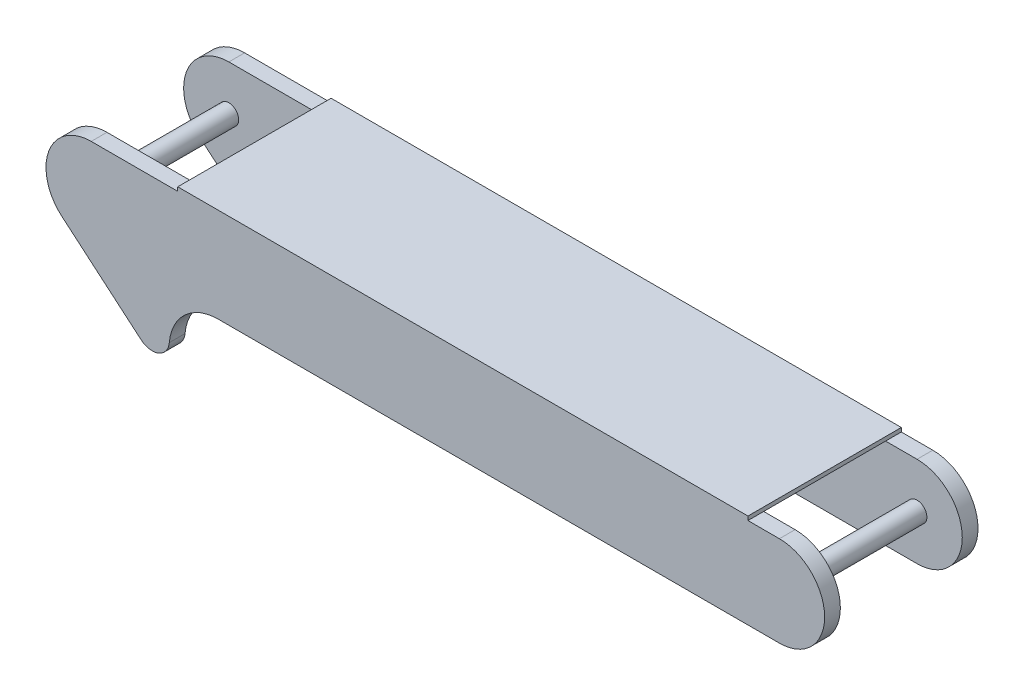
ISO-10303-21;
HEADER;
FILE_DESCRIPTION(('STEP AP214'),'2;1');
FILE_NAME('part.step','',(''),(''),'','','');
FILE_SCHEMA(('AUTOMOTIVE_DESIGN { 1 0 10303 214 1 1 1 1 }'));
ENDSEC;
DATA;
#1=APPLICATION_CONTEXT('core data for automotive mechanical design processes');
#2=APPLICATION_PROTOCOL_DEFINITION('international standard','automotive_design',2000,#1);
#3=PRODUCT_CONTEXT('',#1,'mechanical');
#4=PRODUCT('Part','Part','',(#3));
#5=PRODUCT_RELATED_PRODUCT_CATEGORY('part','',(#4));
#6=PRODUCT_DEFINITION_FORMATION('','',#4);
#7=PRODUCT_DEFINITION_CONTEXT('part definition',#1,'design');
#8=PRODUCT_DEFINITION('design','',#6,#7);
#9=PRODUCT_DEFINITION_SHAPE('','',#8);
#10=(LENGTH_UNIT() NAMED_UNIT(*) SI_UNIT(.MILLI.,.METRE.));
#11=(NAMED_UNIT(*) PLANE_ANGLE_UNIT() SI_UNIT($,.RADIAN.));
#12=(NAMED_UNIT(*) SI_UNIT($,.STERADIAN.) SOLID_ANGLE_UNIT());
#13=UNCERTAINTY_MEASURE_WITH_UNIT(LENGTH_MEASURE(1.E-05),#10,'distance_accuracy_value','');
#14=(GEOMETRIC_REPRESENTATION_CONTEXT(3) GLOBAL_UNCERTAINTY_ASSIGNED_CONTEXT((#13)) GLOBAL_UNIT_ASSIGNED_CONTEXT((#10,
#11,#12)) REPRESENTATION_CONTEXT('',''));
#15=CARTESIAN_POINT('',(0.,0.,0.));
#16=DIRECTION('',(0.,0.,1.));
#17=DIRECTION('',(1.,0.,0.));
#18=AXIS2_PLACEMENT_3D('',#15,#16,#17);
#19=CARTESIAN_POINT('',(0.,0.,31.));
#20=DIRECTION('',(0.,0.,1.));
#21=DIRECTION('',(1.,0.,0.));
#22=AXIS2_PLACEMENT_3D('',#19,#20,#21);
#23=PLANE('',#22);
#24=CARTESIAN_POINT('',(0.,0.,31.0000000000059));
#25=DIRECTION('',(0.,0.,1.));
#26=DIRECTION('',(1.,0.,0.));
#27=AXIS2_PLACEMENT_3D('',#24,#25,#26);
#28=CIRCLE('',#27,5.);
#29=CARTESIAN_POINT('',(5.,0.,31.0000000000059));
#30=VERTEX_POINT('',#29);
#31=EDGE_CURVE('E45',#30,#30,#28,.F.);
#32=ORIENTED_EDGE('',*,*,#31,.F.);
#33=EDGE_LOOP('',(#32));
#34=FACE_BOUND('',#33,.T.);
#35=CARTESIAN_POINT('',(0.,0.,31.));
#36=DIRECTION('',(0.,0.,1.));
#37=DIRECTION('',(1.,0.,0.));
#38=AXIS2_PLACEMENT_3D('',#35,#36,#37);
#39=CIRCLE('',#38,23.);
#40=CARTESIAN_POINT('',(0.,23.,31.));
#41=VERTEX_POINT('',#40);
#42=CARTESIAN_POINT('',(-14.8826787628973,-17.5358453699959,31.));
#43=VERTEX_POINT('',#42);
#44=EDGE_CURVE('E238',#41,#43,#39,.T.);
#45=ORIENTED_EDGE('',*,*,#44,.F.);
#46=DIRECTION('',(-1.,0.,0.));
#47=VECTOR('',#46,1.);
#48=CARTESIAN_POINT('',(0.,23.,31.));
#49=LINE('',#48,#47);
#50=CARTESIAN_POINT('',(44.,23.,31.));
#51=VERTEX_POINT('',#50);
#52=EDGE_CURVE('E257',#51,#41,#49,.T.);
#53=ORIENTED_EDGE('',*,*,#52,.F.);
#54=DIRECTION('',(1.,0.,0.));
#55=VECTOR('',#54,1.);
#56=CARTESIAN_POINT('',(0.,23.,31.));
#57=LINE('',#56,#55);
#58=CARTESIAN_POINT('',(334.,23.,31.));
#59=VERTEX_POINT('',#58);
#60=EDGE_CURVE('E234',#51,#59,#57,.T.);
#61=ORIENTED_EDGE('',*,*,#60,.T.);
#62=CARTESIAN_POINT('',(350.,23.,31.));
#63=VERTEX_POINT('',#62);
#64=EDGE_CURVE('E258',#63,#59,#49,.T.);
#65=ORIENTED_EDGE('',*,*,#64,.F.);
#66=CARTESIAN_POINT('',(350.,0.,31.));
#67=DIRECTION('',(0.,0.,1.));
#68=DIRECTION('',(-1.,0.,0.));
#69=AXIS2_PLACEMENT_3D('',#66,#67,#68);
#70=CIRCLE('',#69,23.);
#71=CARTESIAN_POINT('',(350.,-23.,31.));
#72=VERTEX_POINT('',#71);
#73=EDGE_CURVE('E254',#72,#63,#70,.T.);
#74=ORIENTED_EDGE('',*,*,#73,.F.);
#75=DIRECTION('',(1.,0.,0.));
#76=VECTOR('',#75,1.);
#77=CARTESIAN_POINT('',(64.6164022465225,-23.,31.));
#78=LINE('',#77,#76);
#79=CARTESIAN_POINT('',(64.6164022465225,-23.,31.));
#80=VERTEX_POINT('',#79);
#81=EDGE_CURVE('E251',#80,#72,#78,.T.);
#82=ORIENTED_EDGE('',*,*,#81,.F.);
#83=CARTESIAN_POINT('',(64.6164022465225,-48.,31.));
#84=DIRECTION('',(0.,0.,-1.));
#85=DIRECTION('',(1.,0.,0.));
#86=AXIS2_PLACEMENT_3D('',#83,#84,#85);
#87=CIRCLE('',#86,25.);
#88=CARTESIAN_POINT('',(39.7153635453947,-45.7777777777778,31.));
#89=VERTEX_POINT('',#88);
#90=EDGE_CURVE('E248',#89,#80,#87,.T.);
#91=ORIENTED_EDGE('',*,*,#90,.F.);
#92=CARTESIAN_POINT('',(31.,-45.,31.));
#93=DIRECTION('',(0.,0.,1.));
#94=DIRECTION('',(1.,0.,0.));
#95=AXIS2_PLACEMENT_3D('',#92,#93,#94);
#96=CIRCLE('',#95,8.75000000000001);
#97=CARTESIAN_POINT('',(25.3381113402021,-51.6712455211941,31.));
#98=VERTEX_POINT('',#97);
#99=EDGE_CURVE('E245',#98,#89,#96,.T.);
#100=ORIENTED_EDGE('',*,*,#99,.F.);
#101=DIRECTION('',(0.762428059565039,-0.647072989691186,0.));
#102=VECTOR('',#101,1.);
#103=CARTESIAN_POINT('',(-14.8826787628973,-17.5358453699959,31.));
#104=LINE('',#103,#102);
#105=EDGE_CURVE('E241',#43,#98,#104,.T.);
#106=ORIENTED_EDGE('',*,*,#105,.F.);
#107=EDGE_LOOP('',(#45,#53,#61,#65,#74,#82,#91,#100,#106));
#108=FACE_BOUND('',#107,.T.);
#109=CARTESIAN_POINT('',(350.,0.,31.0000000000059));
#110=DIRECTION('',(0.,0.,1.));
#111=DIRECTION('',(1.,0.,0.));
#112=AXIS2_PLACEMENT_3D('',#109,#110,#111);
#113=CIRCLE('',#112,4.99999999999999);
#114=CARTESIAN_POINT('',(355.,0.,31.0000000000059));
#115=VERTEX_POINT('',#114);
#116=EDGE_CURVE('E11',#115,#115,#113,.F.);
#117=ORIENTED_EDGE('',*,*,#116,.F.);
#118=EDGE_LOOP('',(#117));
#119=FACE_BOUND('',#118,.T.);
#120=ADVANCED_FACE('F37',(#34,#108,#119),#23,.F.);
#121=CARTESIAN_POINT('',(0.,0.,-31.));
#122=DIRECTION('',(0.,0.,1.));
#123=DIRECTION('',(1.,0.,0.));
#124=AXIS2_PLACEMENT_3D('',#121,#122,#123);
#125=PLANE('',#124);
#126=CARTESIAN_POINT('',(0.,0.,-31.));
#127=DIRECTION('',(0.,0.,1.));
#128=DIRECTION('',(1.,0.,0.));
#129=AXIS2_PLACEMENT_3D('',#126,#127,#128);
#130=CIRCLE('',#129,5.);
#131=CARTESIAN_POINT('',(5.,0.,-31.));
#132=VERTEX_POINT('',#131);
#133=EDGE_CURVE('E462',#132,#132,#130,.T.);
#134=ORIENTED_EDGE('',*,*,#133,.F.);
#135=EDGE_LOOP('',(#134));
#136=FACE_BOUND('',#135,.T.);
#137=CARTESIAN_POINT('',(0.,0.,-31.));
#138=DIRECTION('',(0.,0.,1.));
#139=DIRECTION('',(1.,0.,0.));
#140=AXIS2_PLACEMENT_3D('',#137,#138,#139);
#141=CIRCLE('',#140,23.);
#142=CARTESIAN_POINT('',(0.,23.,-31.));
#143=VERTEX_POINT('',#142);
#144=CARTESIAN_POINT('',(-14.8826787628973,-17.5358453699959,-31.));
#145=VERTEX_POINT('',#144);
#146=EDGE_CURVE('E186',#143,#145,#141,.T.);
#147=ORIENTED_EDGE('',*,*,#146,.T.);
#148=DIRECTION('',(0.762428059565039,-0.647072989691186,0.));
#149=VECTOR('',#148,1.);
#150=CARTESIAN_POINT('',(-14.8826787628973,-17.5358453699959,-31.));
#151=LINE('',#150,#149);
#152=CARTESIAN_POINT('',(25.3381113402021,-51.6712455211941,-31.));
#153=VERTEX_POINT('',#152);
#154=EDGE_CURVE('E176',#145,#153,#151,.T.);
#155=ORIENTED_EDGE('',*,*,#154,.T.);
#156=CARTESIAN_POINT('',(31.,-45.,-31.));
#157=DIRECTION('',(0.,0.,1.));
#158=DIRECTION('',(1.,0.,0.));
#159=AXIS2_PLACEMENT_3D('',#156,#157,#158);
#160=CIRCLE('',#159,8.75000000000001);
#161=CARTESIAN_POINT('',(39.7153635453947,-45.7777777777778,-31.));
#162=VERTEX_POINT('',#161);
#163=EDGE_CURVE('E185',#153,#162,#160,.T.);
#164=ORIENTED_EDGE('',*,*,#163,.T.);
#165=CARTESIAN_POINT('',(64.6164022465225,-48.,-31.));
#166=DIRECTION('',(0.,0.,-1.));
#167=DIRECTION('',(1.,0.,0.));
#168=AXIS2_PLACEMENT_3D('',#165,#166,#167);
#169=CIRCLE('',#168,25.);
#170=CARTESIAN_POINT('',(64.6164022465225,-23.,-31.));
#171=VERTEX_POINT('',#170);
#172=EDGE_CURVE('E453',#162,#171,#169,.T.);
#173=ORIENTED_EDGE('',*,*,#172,.T.);
#174=DIRECTION('',(1.,0.,0.));
#175=VECTOR('',#174,1.);
#176=CARTESIAN_POINT('',(64.6164022465225,-23.,-31.));
#177=LINE('',#176,#175);
#178=CARTESIAN_POINT('',(350.,-23.,-31.));
#179=VERTEX_POINT('',#178);
#180=EDGE_CURVE('E466',#171,#179,#177,.T.);
#181=ORIENTED_EDGE('',*,*,#180,.T.);
#182=CARTESIAN_POINT('',(350.,0.,-31.));
#183=DIRECTION('',(0.,0.,1.));
#184=DIRECTION('',(1.,0.,0.));
#185=AXIS2_PLACEMENT_3D('',#182,#183,#184);
#186=CIRCLE('',#185,23.);
#187=CARTESIAN_POINT('',(350.,23.,-31.));
#188=VERTEX_POINT('',#187);
#189=EDGE_CURVE('E464',#179,#188,#186,.T.);
#190=ORIENTED_EDGE('',*,*,#189,.T.);
#191=DIRECTION('',(-1.,0.,0.));
#192=VECTOR('',#191,1.);
#193=CARTESIAN_POINT('',(350.,23.,-31.));
#194=LINE('',#193,#192);
#195=CARTESIAN_POINT('',(334.,23.,-31.));
#196=VERTEX_POINT('',#195);
#197=EDGE_CURVE('E423',#188,#196,#194,.T.);
#198=ORIENTED_EDGE('',*,*,#197,.T.);
#199=CARTESIAN_POINT('',(44.,23.,-31.));
#200=VERTEX_POINT('',#199);
#201=EDGE_CURVE('E52',#196,#200,#194,.T.);
#202=ORIENTED_EDGE('',*,*,#201,.T.);
#203=EDGE_CURVE('E191',#200,#143,#194,.T.);
#204=ORIENTED_EDGE('',*,*,#203,.T.);
#205=EDGE_LOOP('',(#147,#155,#164,#173,#181,#190,#198,#202,#204));
#206=FACE_BOUND('',#205,.T.);
#207=CARTESIAN_POINT('',(350.,0.,-31.0000000000059));
#208=DIRECTION('',(0.,0.,1.));
#209=DIRECTION('',(1.,0.,0.));
#210=AXIS2_PLACEMENT_3D('',#207,#208,#209);
#211=CIRCLE('',#210,4.99999999999999);
#212=CARTESIAN_POINT('',(355.,0.,-31.0000000000059));
#213=VERTEX_POINT('',#212);
#214=EDGE_CURVE('E472',#213,#213,#211,.T.);
#215=ORIENTED_EDGE('',*,*,#214,.F.);
#216=EDGE_LOOP('',(#215));
#217=FACE_BOUND('',#216,.T.);
#218=ADVANCED_FACE('F189',(#136,#206,#217),#125,.T.);
#219=CARTESIAN_POINT('',(0.,23.,31.));
#220=DIRECTION('',(0.,1.,0.));
#221=DIRECTION('',(0.,0.,1.));
#222=AXIS2_PLACEMENT_3D('',#219,#220,#221);
#223=PLANE('',#222);
#224=ORIENTED_EDGE('',*,*,#64,.T.);
#225=DIRECTION('',(0.,0.,-1.));
#226=VECTOR('',#225,1.);
#227=CARTESIAN_POINT('',(334.,23.,-39.));
#228=LINE('',#227,#226);
#229=CARTESIAN_POINT('',(334.,23.,39.));
#230=VERTEX_POINT('',#229);
#231=EDGE_CURVE('E219',#230,#59,#228,.T.);
#232=ORIENTED_EDGE('',*,*,#231,.F.);
#233=DIRECTION('',(-1.,0.,0.));
#234=VECTOR('',#233,1.);
#235=CARTESIAN_POINT('',(0.,23.,39.));
#236=LINE('',#235,#234);
#237=CARTESIAN_POINT('',(350.,23.,39.));
#238=VERTEX_POINT('',#237);
#239=EDGE_CURVE('E242',#238,#230,#236,.T.);
#240=ORIENTED_EDGE('',*,*,#239,.F.);
#241=DIRECTION('',(0.,0.,1.));
#242=VECTOR('',#241,1.);
#243=CARTESIAN_POINT('',(350.,23.,31.));
#244=LINE('',#243,#242);
#245=EDGE_CURVE('E285',#63,#238,#244,.T.);
#246=ORIENTED_EDGE('',*,*,#245,.F.);
#247=EDGE_LOOP('',(#224,#232,#240,#246));
#248=FACE_BOUND('',#247,.T.);
#249=ADVANCED_FACE('F323',(#248),#223,.T.);
#250=CARTESIAN_POINT('',(44.,23.,39.));
#251=VERTEX_POINT('',#250);
#252=CARTESIAN_POINT('',(0.,23.,39.));
#253=VERTEX_POINT('',#252);
#254=EDGE_CURVE('E279',#251,#253,#236,.T.);
#255=ORIENTED_EDGE('',*,*,#254,.F.);
#256=DIRECTION('',(0.,0.,1.));
#257=VECTOR('',#256,1.);
#258=CARTESIAN_POINT('',(44.,23.,-39.));
#259=LINE('',#258,#257);
#260=EDGE_CURVE('E222',#51,#251,#259,.T.);
#261=ORIENTED_EDGE('',*,*,#260,.F.);
#262=ORIENTED_EDGE('',*,*,#52,.T.);
#263=DIRECTION('',(0.,0.,1.));
#264=VECTOR('',#263,1.);
#265=CARTESIAN_POINT('',(0.,23.,31.));
#266=LINE('',#265,#264);
#267=EDGE_CURVE('E282',#41,#253,#266,.T.);
#268=ORIENTED_EDGE('',*,*,#267,.T.);
#269=EDGE_LOOP('',(#255,#261,#262,#268));
#270=FACE_BOUND('',#269,.T.);
#271=ADVANCED_FACE('F375',(#270),#223,.T.);
#272=CARTESIAN_POINT('',(0.,0.,31.));
#273=DIRECTION('',(0.,0.,1.));
#274=DIRECTION('',(1.,0.,0.));
#275=AXIS2_PLACEMENT_3D('',#272,#273,#274);
#276=CYLINDRICAL_SURFACE('',#275,23.);
#277=CARTESIAN_POINT('',(0.,0.,39.));
#278=DIRECTION('',(0.,0.,1.));
#279=DIRECTION('',(1.,0.,0.));
#280=AXIS2_PLACEMENT_3D('',#277,#278,#279);
#281=CIRCLE('',#280,23.);
#282=CARTESIAN_POINT('',(-14.8826787628973,-17.5358453699959,39.));
#283=VERTEX_POINT('',#282);
#284=EDGE_CURVE('E237',#253,#283,#281,.T.);
#285=ORIENTED_EDGE('',*,*,#284,.F.);
#286=ORIENTED_EDGE('',*,*,#267,.F.);
#287=ORIENTED_EDGE('',*,*,#44,.T.);
#288=DIRECTION('',(0.,0.,1.));
#289=VECTOR('',#288,1.);
#290=CARTESIAN_POINT('',(-14.8826787628973,-17.5358453699959,31.));
#291=LINE('',#290,#289);
#292=EDGE_CURVE('E261',#43,#283,#291,.T.);
#293=ORIENTED_EDGE('',*,*,#292,.T.);
#294=EDGE_LOOP('',(#285,#286,#287,#293));
#295=FACE_BOUND('',#294,.T.);
#296=ADVANCED_FACE('F39',(#295),#276,.T.);
#297=CARTESIAN_POINT('',(350.,0.,31.));
#298=DIRECTION('',(0.,0.,1.));
#299=DIRECTION('',(1.,0.,0.));
#300=AXIS2_PLACEMENT_3D('',#297,#298,#299);
#301=CYLINDRICAL_SURFACE('',#300,23.);
#302=CARTESIAN_POINT('',(350.,0.,39.));
#303=DIRECTION('',(0.,0.,1.));
#304=DIRECTION('',(-1.,0.,0.));
#305=AXIS2_PLACEMENT_3D('',#302,#303,#304);
#306=CIRCLE('',#305,23.);
#307=CARTESIAN_POINT('',(350.,-23.,39.));
#308=VERTEX_POINT('',#307);
#309=EDGE_CURVE('E276',#308,#238,#306,.T.);
#310=ORIENTED_EDGE('',*,*,#309,.F.);
#311=DIRECTION('',(0.,0.,1.));
#312=VECTOR('',#311,1.);
#313=CARTESIAN_POINT('',(350.,-23.,31.));
#314=LINE('',#313,#312);
#315=EDGE_CURVE('E287',#72,#308,#314,.T.);
#316=ORIENTED_EDGE('',*,*,#315,.F.);
#317=ORIENTED_EDGE('',*,*,#73,.T.);
#318=ORIENTED_EDGE('',*,*,#245,.T.);
#319=EDGE_LOOP('',(#310,#316,#317,#318));
#320=FACE_BOUND('',#319,.T.);
#321=ADVANCED_FACE('F377',(#320),#301,.T.);
#322=CARTESIAN_POINT('',(64.6164022465225,-23.,31.));
#323=DIRECTION('',(0.,-1.,0.));
#324=DIRECTION('',(0.,0.,-1.));
#325=AXIS2_PLACEMENT_3D('',#322,#323,#324);
#326=PLANE('',#325);
#327=DIRECTION('',(1.,0.,0.));
#328=VECTOR('',#327,1.);
#329=CARTESIAN_POINT('',(64.6164022465225,-23.,39.));
#330=LINE('',#329,#328);
#331=CARTESIAN_POINT('',(64.6164022465225,-23.,39.));
#332=VERTEX_POINT('',#331);
#333=EDGE_CURVE('E273',#332,#308,#330,.T.);
#334=ORIENTED_EDGE('',*,*,#333,.F.);
#335=DIRECTION('',(0.,0.,1.));
#336=VECTOR('',#335,1.);
#337=CARTESIAN_POINT('',(64.6164022465225,-23.,31.));
#338=LINE('',#337,#336);
#339=EDGE_CURVE('E289',#80,#332,#338,.T.);
#340=ORIENTED_EDGE('',*,*,#339,.F.);
#341=ORIENTED_EDGE('',*,*,#81,.T.);
#342=ORIENTED_EDGE('',*,*,#315,.T.);
#343=EDGE_LOOP('',(#334,#340,#341,#342));
#344=FACE_BOUND('',#343,.T.);
#345=ADVANCED_FACE('F380',(#344),#326,.T.);
#346=CARTESIAN_POINT('',(64.6164022465225,-48.,31.));
#347=DIRECTION('',(0.,0.,1.));
#348=DIRECTION('',(1.,0.,0.));
#349=AXIS2_PLACEMENT_3D('',#346,#347,#348);
#350=CYLINDRICAL_SURFACE('',#349,25.);
#351=CARTESIAN_POINT('',(64.6164022465225,-48.,39.));
#352=DIRECTION('',(0.,0.,-1.));
#353=DIRECTION('',(1.,0.,0.));
#354=AXIS2_PLACEMENT_3D('',#351,#352,#353);
#355=CIRCLE('',#354,25.);
#356=CARTESIAN_POINT('',(39.7153635453947,-45.7777777777778,39.));
#357=VERTEX_POINT('',#356);
#358=EDGE_CURVE('E270',#357,#332,#355,.T.);
#359=ORIENTED_EDGE('',*,*,#358,.F.);
#360=DIRECTION('',(0.,0.,1.));
#361=VECTOR('',#360,1.);
#362=CARTESIAN_POINT('',(39.7153635453947,-45.7777777777778,31.));
#363=LINE('',#362,#361);
#364=EDGE_CURVE('E291',#89,#357,#363,.T.);
#365=ORIENTED_EDGE('',*,*,#364,.F.);
#366=ORIENTED_EDGE('',*,*,#90,.T.);
#367=ORIENTED_EDGE('',*,*,#339,.T.);
#368=EDGE_LOOP('',(#359,#365,#366,#367));
#369=FACE_BOUND('',#368,.T.);
#370=ADVANCED_FACE('F384',(#369),#350,.F.);
#371=CARTESIAN_POINT('',(31.,-45.,31.));
#372=DIRECTION('',(0.,0.,1.));
#373=DIRECTION('',(1.,0.,0.));
#374=AXIS2_PLACEMENT_3D('',#371,#372,#373);
#375=CYLINDRICAL_SURFACE('',#374,8.75000000000001);
#376=CARTESIAN_POINT('',(31.,-45.,39.));
#377=DIRECTION('',(0.,0.,1.));
#378=DIRECTION('',(1.,0.,0.));
#379=AXIS2_PLACEMENT_3D('',#376,#377,#378);
#380=CIRCLE('',#379,8.75000000000001);
#381=CARTESIAN_POINT('',(25.3381113402021,-51.6712455211941,39.));
#382=VERTEX_POINT('',#381);
#383=EDGE_CURVE('E267',#382,#357,#380,.T.);
#384=ORIENTED_EDGE('',*,*,#383,.F.);
#385=DIRECTION('',(0.,0.,1.));
#386=VECTOR('',#385,1.);
#387=CARTESIAN_POINT('',(25.3381113402021,-51.6712455211941,31.));
#388=LINE('',#387,#386);
#389=EDGE_CURVE('E293',#98,#382,#388,.T.);
#390=ORIENTED_EDGE('',*,*,#389,.F.);
#391=ORIENTED_EDGE('',*,*,#99,.T.);
#392=ORIENTED_EDGE('',*,*,#364,.T.);
#393=EDGE_LOOP('',(#384,#390,#391,#392));
#394=FACE_BOUND('',#393,.T.);
#395=ADVANCED_FACE('F388',(#394),#375,.T.);
#396=CARTESIAN_POINT('',(-14.8826787628973,-17.5358453699959,31.));
#397=DIRECTION('',(-0.647072989691186,-0.762428059565039,0.));
#398=DIRECTION('',(0.762428059565039,-0.647072989691186,0.));
#399=AXIS2_PLACEMENT_3D('',#396,#397,#398);
#400=PLANE('',#399);
#401=DIRECTION('',(0.762428059565039,-0.647072989691186,0.));
#402=VECTOR('',#401,1.);
#403=CARTESIAN_POINT('',(-14.8826787628973,-17.5358453699959,39.));
#404=LINE('',#403,#402);
#405=EDGE_CURVE('E264',#283,#382,#404,.T.);
#406=ORIENTED_EDGE('',*,*,#405,.F.);
#407=ORIENTED_EDGE('',*,*,#292,.F.);
#408=ORIENTED_EDGE('',*,*,#105,.T.);
#409=ORIENTED_EDGE('',*,*,#389,.T.);
#410=EDGE_LOOP('',(#406,#407,#408,#409));
#411=FACE_BOUND('',#410,.T.);
#412=ADVANCED_FACE('F372',(#411),#400,.T.);
#413=CARTESIAN_POINT('',(0.,0.,39.));
#414=DIRECTION('',(0.,0.,1.));
#415=DIRECTION('',(1.,0.,0.));
#416=AXIS2_PLACEMENT_3D('',#413,#414,#415);
#417=PLANE('',#416);
#418=ORIENTED_EDGE('',*,*,#284,.T.);
#419=ORIENTED_EDGE('',*,*,#405,.T.);
#420=ORIENTED_EDGE('',*,*,#383,.T.);
#421=ORIENTED_EDGE('',*,*,#358,.T.);
#422=ORIENTED_EDGE('',*,*,#333,.T.);
#423=ORIENTED_EDGE('',*,*,#309,.T.);
#424=ORIENTED_EDGE('',*,*,#239,.T.);
#425=DIRECTION('',(0.,-1.,0.));
#426=VECTOR('',#425,1.);
#427=CARTESIAN_POINT('',(334.,25.,39.));
#428=LINE('',#427,#426);
#429=CARTESIAN_POINT('',(334.,25.,39.));
#430=VERTEX_POINT('',#429);
#431=EDGE_CURVE('E218',#430,#230,#428,.T.);
#432=ORIENTED_EDGE('',*,*,#431,.F.);
#433=DIRECTION('',(1.,0.,0.));
#434=VECTOR('',#433,1.);
#435=CARTESIAN_POINT('',(334.,25.,39.));
#436=LINE('',#435,#434);
#437=CARTESIAN_POINT('',(44.,25.,39.));
#438=VERTEX_POINT('',#437);
#439=EDGE_CURVE('E216',#438,#430,#436,.T.);
#440=ORIENTED_EDGE('',*,*,#439,.F.);
#441=DIRECTION('',(0.,-1.,0.));
#442=VECTOR('',#441,1.);
#443=CARTESIAN_POINT('',(44.,25.,39.));
#444=LINE('',#443,#442);
#445=EDGE_CURVE('E60',#438,#251,#444,.T.);
#446=ORIENTED_EDGE('',*,*,#445,.T.);
#447=ORIENTED_EDGE('',*,*,#254,.T.);
#448=EDGE_LOOP('',(#418,#419,#420,#421,#422,#423,#424,#432,#440,#446,#447));
#449=FACE_BOUND('',#448,.T.);
#450=ADVANCED_FACE('F358',(#449),#417,.T.);
#451=CARTESIAN_POINT('',(0.,23.,0.));
#452=DIRECTION('',(0.,-1.,0.));
#453=DIRECTION('',(0.,0.,-1.));
#454=AXIS2_PLACEMENT_3D('',#451,#452,#453);
#455=PLANE('',#454);
#456=ORIENTED_EDGE('',*,*,#201,.F.);
#457=EDGE_CURVE('E202',#59,#196,#228,.T.);
#458=ORIENTED_EDGE('',*,*,#457,.F.);
#459=ORIENTED_EDGE('',*,*,#60,.F.);
#460=EDGE_CURVE('E225',#200,#51,#259,.T.);
#461=ORIENTED_EDGE('',*,*,#460,.F.);
#462=EDGE_LOOP('',(#456,#458,#459,#461));
#463=FACE_BOUND('',#462,.T.);
#464=ADVANCED_FACE('F354',(#463),#455,.T.);
#465=CARTESIAN_POINT('',(334.,25.,-39.));
#466=DIRECTION('',(-1.,0.,0.));
#467=DIRECTION('',(0.,0.,1.));
#468=AXIS2_PLACEMENT_3D('',#465,#466,#467);
#469=PLANE('',#468);
#470=ORIENTED_EDGE('',*,*,#231,.T.);
#471=ORIENTED_EDGE('',*,*,#457,.T.);
#472=DIRECTION('',(0.,0.,1.));
#473=VECTOR('',#472,1.);
#474=CARTESIAN_POINT('',(334.,23.,-39.));
#475=LINE('',#474,#473);
#476=CARTESIAN_POINT('',(334.,23.,-39.));
#477=VERTEX_POINT('',#476);
#478=EDGE_CURVE('E200',#477,#196,#475,.T.);
#479=ORIENTED_EDGE('',*,*,#478,.F.);
#480=DIRECTION('',(0.,-1.,0.));
#481=VECTOR('',#480,1.);
#482=CARTESIAN_POINT('',(334.,25.,-39.));
#483=LINE('',#482,#481);
#484=CARTESIAN_POINT('',(334.,25.,-39.));
#485=VERTEX_POINT('',#484);
#486=EDGE_CURVE('E231',#485,#477,#483,.T.);
#487=ORIENTED_EDGE('',*,*,#486,.F.);
#488=DIRECTION('',(0.,0.,-1.));
#489=VECTOR('',#488,1.);
#490=CARTESIAN_POINT('',(334.,25.,-39.));
#491=LINE('',#490,#489);
#492=EDGE_CURVE('E208',#430,#485,#491,.T.);
#493=ORIENTED_EDGE('',*,*,#492,.F.);
#494=ORIENTED_EDGE('',*,*,#431,.T.);
#495=EDGE_LOOP('',(#470,#471,#479,#487,#493,#494));
#496=FACE_BOUND('',#495,.T.);
#497=ADVANCED_FACE('F357',(#496),#469,.F.);
#498=CARTESIAN_POINT('',(334.,25.,-39.));
#499=DIRECTION('',(0.,0.,1.));
#500=DIRECTION('',(1.,0.,0.));
#501=AXIS2_PLACEMENT_3D('',#498,#499,#500);
#502=PLANE('',#501);
#503=ORIENTED_EDGE('',*,*,#486,.T.);
#504=DIRECTION('',(-1.,0.,0.));
#505=VECTOR('',#504,1.);
#506=CARTESIAN_POINT('',(350.,23.,-39.));
#507=LINE('',#506,#505);
#508=CARTESIAN_POINT('',(350.,23.,-39.));
#509=VERTEX_POINT('',#508);
#510=EDGE_CURVE('E195',#509,#477,#507,.T.);
#511=ORIENTED_EDGE('',*,*,#510,.F.);
#512=CARTESIAN_POINT('',(350.,0.,-39.));
#513=DIRECTION('',(0.,0.,1.));
#514=DIRECTION('',(1.,0.,0.));
#515=AXIS2_PLACEMENT_3D('',#512,#513,#514);
#516=CIRCLE('',#515,23.);
#517=CARTESIAN_POINT('',(350.,-23.,-39.));
#518=VERTEX_POINT('',#517);
#519=EDGE_CURVE('E431',#518,#509,#516,.T.);
#520=ORIENTED_EDGE('',*,*,#519,.F.);
#521=DIRECTION('',(1.,0.,0.));
#522=VECTOR('',#521,1.);
#523=CARTESIAN_POINT('',(64.6164022465225,-23.,-39.));
#524=LINE('',#523,#522);
#525=CARTESIAN_POINT('',(64.6164022465225,-23.,-39.));
#526=VERTEX_POINT('',#525);
#527=EDGE_CURVE('E433',#526,#518,#524,.T.);
#528=ORIENTED_EDGE('',*,*,#527,.F.);
#529=CARTESIAN_POINT('',(64.6164022465225,-48.,-39.));
#530=DIRECTION('',(0.,0.,-1.));
#531=DIRECTION('',(1.,0.,0.));
#532=AXIS2_PLACEMENT_3D('',#529,#530,#531);
#533=CIRCLE('',#532,25.);
#534=CARTESIAN_POINT('',(39.7153635453947,-45.7777777777778,-39.));
#535=VERTEX_POINT('',#534);
#536=EDGE_CURVE('E452',#535,#526,#533,.T.);
#537=ORIENTED_EDGE('',*,*,#536,.F.);
#538=CARTESIAN_POINT('',(31.,-45.,-39.));
#539=DIRECTION('',(0.,0.,1.));
#540=DIRECTION('',(1.,0.,0.));
#541=AXIS2_PLACEMENT_3D('',#538,#539,#540);
#542=CIRCLE('',#541,8.75000000000001);
#543=CARTESIAN_POINT('',(25.3381113402021,-51.6712455211941,-39.));
#544=VERTEX_POINT('',#543);
#545=EDGE_CURVE('E456',#544,#535,#542,.T.);
#546=ORIENTED_EDGE('',*,*,#545,.F.);
#547=DIRECTION('',(0.762428059565039,-0.647072989691186,0.));
#548=VECTOR('',#547,1.);
#549=CARTESIAN_POINT('',(-14.8826787628973,-17.5358453699959,-39.));
#550=LINE('',#549,#548);
#551=CARTESIAN_POINT('',(-14.8826787628973,-17.5358453699959,-39.));
#552=VERTEX_POINT('',#551);
#553=EDGE_CURVE('E458',#552,#544,#550,.T.);
#554=ORIENTED_EDGE('',*,*,#553,.F.);
#555=CARTESIAN_POINT('',(0.,0.,-39.));
#556=DIRECTION('',(0.,0.,1.));
#557=DIRECTION('',(1.,0.,0.));
#558=AXIS2_PLACEMENT_3D('',#555,#556,#557);
#559=CIRCLE('',#558,23.);
#560=CARTESIAN_POINT('',(0.,23.,-39.));
#561=VERTEX_POINT('',#560);
#562=EDGE_CURVE('E199',#561,#552,#559,.T.);
#563=ORIENTED_EDGE('',*,*,#562,.F.);
#564=CARTESIAN_POINT('',(44.,23.,-39.));
#565=VERTEX_POINT('',#564);
#566=EDGE_CURVE('E429',#565,#561,#507,.T.);
#567=ORIENTED_EDGE('',*,*,#566,.F.);
#568=DIRECTION('',(0.,-1.,0.));
#569=VECTOR('',#568,1.);
#570=CARTESIAN_POINT('',(44.,25.,-39.));
#571=LINE('',#570,#569);
#572=CARTESIAN_POINT('',(44.,25.,-39.));
#573=VERTEX_POINT('',#572);
#574=EDGE_CURVE('E228',#573,#565,#571,.T.);
#575=ORIENTED_EDGE('',*,*,#574,.F.);
#576=DIRECTION('',(-1.,0.,0.));
#577=VECTOR('',#576,1.);
#578=CARTESIAN_POINT('',(334.,25.,-39.));
#579=LINE('',#578,#577);
#580=EDGE_CURVE('E211',#485,#573,#579,.T.);
#581=ORIENTED_EDGE('',*,*,#580,.F.);
#582=EDGE_LOOP('',(#503,#511,#520,#528,#537,#546,#554,#563,#567,#575,#581));
#583=FACE_BOUND('',#582,.T.);
#584=ADVANCED_FACE('F362',(#583),#502,.F.);
#585=CARTESIAN_POINT('',(44.,25.,-39.));
#586=DIRECTION('',(1.,0.,0.));
#587=DIRECTION('',(0.,0.,-1.));
#588=AXIS2_PLACEMENT_3D('',#585,#586,#587);
#589=PLANE('',#588);
#590=EDGE_CURVE('E212',#565,#200,#259,.T.);
#591=ORIENTED_EDGE('',*,*,#590,.T.);
#592=ORIENTED_EDGE('',*,*,#460,.T.);
#593=ORIENTED_EDGE('',*,*,#260,.T.);
#594=ORIENTED_EDGE('',*,*,#445,.F.);
#595=DIRECTION('',(0.,0.,1.));
#596=VECTOR('',#595,1.);
#597=CARTESIAN_POINT('',(44.,25.,-39.));
#598=LINE('',#597,#596);
#599=EDGE_CURVE('E214',#573,#438,#598,.T.);
#600=ORIENTED_EDGE('',*,*,#599,.F.);
#601=ORIENTED_EDGE('',*,*,#574,.T.);
#602=EDGE_LOOP('',(#591,#592,#593,#594,#600,#601));
#603=FACE_BOUND('',#602,.T.);
#604=ADVANCED_FACE('F352',(#603),#589,.F.);
#605=CARTESIAN_POINT('',(0.,25.,0.));
#606=DIRECTION('',(0.,-1.,0.));
#607=DIRECTION('',(0.,0.,-1.));
#608=AXIS2_PLACEMENT_3D('',#605,#606,#607);
#609=PLANE('',#608);
#610=ORIENTED_EDGE('',*,*,#492,.T.);
#611=ORIENTED_EDGE('',*,*,#580,.T.);
#612=ORIENTED_EDGE('',*,*,#599,.T.);
#613=ORIENTED_EDGE('',*,*,#439,.T.);
#614=EDGE_LOOP('',(#610,#611,#612,#613));
#615=FACE_BOUND('',#614,.T.);
#616=ADVANCED_FACE('F329',(#615),#609,.F.);
#617=CARTESIAN_POINT('',(350.,23.,-31.));
#618=DIRECTION('',(0.,-1.,0.));
#619=DIRECTION('',(0.,0.,-1.));
#620=AXIS2_PLACEMENT_3D('',#617,#618,#619);
#621=PLANE('',#620);
#622=ORIENTED_EDGE('',*,*,#510,.T.);
#623=ORIENTED_EDGE('',*,*,#478,.T.);
#624=ORIENTED_EDGE('',*,*,#197,.F.);
#625=DIRECTION('',(0.,0.,-1.));
#626=VECTOR('',#625,1.);
#627=CARTESIAN_POINT('',(350.,23.,-31.));
#628=LINE('',#627,#626);
#629=EDGE_CURVE('E439',#188,#509,#628,.T.);
#630=ORIENTED_EDGE('',*,*,#629,.T.);
#631=EDGE_LOOP('',(#622,#623,#624,#630));
#632=FACE_BOUND('',#631,.T.);
#633=ADVANCED_FACE('F325',(#632),#621,.F.);
#634=ORIENTED_EDGE('',*,*,#203,.F.);
#635=ORIENTED_EDGE('',*,*,#590,.F.);
#636=ORIENTED_EDGE('',*,*,#566,.T.);
#637=DIRECTION('',(0.,0.,-1.));
#638=VECTOR('',#637,1.);
#639=CARTESIAN_POINT('',(0.,23.,-31.));
#640=LINE('',#639,#638);
#641=EDGE_CURVE('E437',#143,#561,#640,.T.);
#642=ORIENTED_EDGE('',*,*,#641,.F.);
#643=EDGE_LOOP('',(#634,#635,#636,#642));
#644=FACE_BOUND('',#643,.T.);
#645=ADVANCED_FACE('F328',(#644),#621,.F.);
#646=CARTESIAN_POINT('',(0.,0.,-31.));
#647=DIRECTION('',(0.,0.,-1.));
#648=DIRECTION('',(-1.,0.,0.));
#649=AXIS2_PLACEMENT_3D('',#646,#647,#648);
#650=CYLINDRICAL_SURFACE('',#649,23.);
#651=ORIENTED_EDGE('',*,*,#562,.T.);
#652=DIRECTION('',(0.,0.,-1.));
#653=VECTOR('',#652,1.);
#654=CARTESIAN_POINT('',(-14.8826787628973,-17.5358453699959,-31.));
#655=LINE('',#654,#653);
#656=EDGE_CURVE('E180',#145,#552,#655,.T.);
#657=ORIENTED_EDGE('',*,*,#656,.F.);
#658=ORIENTED_EDGE('',*,*,#146,.F.);
#659=ORIENTED_EDGE('',*,*,#641,.T.);
#660=EDGE_LOOP('',(#651,#657,#658,#659));
#661=FACE_BOUND('',#660,.T.);
#662=ADVANCED_FACE('F197',(#661),#650,.T.);
#663=CARTESIAN_POINT('',(-14.8826787628973,-17.5358453699959,-31.));
#664=DIRECTION('',(0.647072989691186,0.762428059565039,0.));
#665=DIRECTION('',(-0.762428059565039,0.647072989691186,0.));
#666=AXIS2_PLACEMENT_3D('',#663,#664,#665);
#667=PLANE('',#666);
#668=ORIENTED_EDGE('',*,*,#553,.T.);
#669=DIRECTION('',(0.,0.,-1.));
#670=VECTOR('',#669,1.);
#671=CARTESIAN_POINT('',(25.3381113402021,-51.6712455211941,-31.));
#672=LINE('',#671,#670);
#673=EDGE_CURVE('E183',#153,#544,#672,.T.);
#674=ORIENTED_EDGE('',*,*,#673,.F.);
#675=ORIENTED_EDGE('',*,*,#154,.F.);
#676=ORIENTED_EDGE('',*,*,#656,.T.);
#677=EDGE_LOOP('',(#668,#674,#675,#676));
#678=FACE_BOUND('',#677,.T.);
#679=ADVANCED_FACE('F178',(#678),#667,.F.);
#680=CARTESIAN_POINT('',(31.,-45.,-31.));
#681=DIRECTION('',(0.,0.,-1.));
#682=DIRECTION('',(-1.,0.,0.));
#683=AXIS2_PLACEMENT_3D('',#680,#681,#682);
#684=CYLINDRICAL_SURFACE('',#683,8.75000000000001);
#685=ORIENTED_EDGE('',*,*,#545,.T.);
#686=DIRECTION('',(0.,0.,-1.));
#687=VECTOR('',#686,1.);
#688=CARTESIAN_POINT('',(39.7153635453947,-45.7777777777778,-31.));
#689=LINE('',#688,#687);
#690=EDGE_CURVE('E204',#162,#535,#689,.T.);
#691=ORIENTED_EDGE('',*,*,#690,.F.);
#692=ORIENTED_EDGE('',*,*,#163,.F.);
#693=ORIENTED_EDGE('',*,*,#673,.T.);
#694=EDGE_LOOP('',(#685,#691,#692,#693));
#695=FACE_BOUND('',#694,.T.);
#696=ADVANCED_FACE('F341',(#695),#684,.T.);
#697=CARTESIAN_POINT('',(64.6164022465225,-48.,-31.));
#698=DIRECTION('',(0.,0.,-1.));
#699=DIRECTION('',(-1.,0.,0.));
#700=AXIS2_PLACEMENT_3D('',#697,#698,#699);
#701=CYLINDRICAL_SURFACE('',#700,25.);
#702=ORIENTED_EDGE('',*,*,#536,.T.);
#703=DIRECTION('',(0.,0.,-1.));
#704=VECTOR('',#703,1.);
#705=CARTESIAN_POINT('',(64.6164022465225,-23.,-31.));
#706=LINE('',#705,#704);
#707=EDGE_CURVE('E445',#171,#526,#706,.T.);
#708=ORIENTED_EDGE('',*,*,#707,.F.);
#709=ORIENTED_EDGE('',*,*,#172,.F.);
#710=ORIENTED_EDGE('',*,*,#690,.T.);
#711=EDGE_LOOP('',(#702,#708,#709,#710));
#712=FACE_BOUND('',#711,.T.);
#713=ADVANCED_FACE('F337',(#712),#701,.F.);
#714=CARTESIAN_POINT('',(64.6164022465225,-23.,-31.));
#715=DIRECTION('',(0.,1.,0.));
#716=DIRECTION('',(-1.,0.,0.));
#717=AXIS2_PLACEMENT_3D('',#714,#715,#716);
#718=PLANE('',#717);
#719=ORIENTED_EDGE('',*,*,#527,.T.);
#720=DIRECTION('',(0.,0.,-1.));
#721=VECTOR('',#720,1.);
#722=CARTESIAN_POINT('',(350.,-23.,-31.));
#723=LINE('',#722,#721);
#724=EDGE_CURVE('E442',#179,#518,#723,.T.);
#725=ORIENTED_EDGE('',*,*,#724,.F.);
#726=ORIENTED_EDGE('',*,*,#180,.F.);
#727=ORIENTED_EDGE('',*,*,#707,.T.);
#728=EDGE_LOOP('',(#719,#725,#726,#727));
#729=FACE_BOUND('',#728,.T.);
#730=ADVANCED_FACE('F333',(#729),#718,.F.);
#731=CARTESIAN_POINT('',(350.,0.,-31.));
#732=DIRECTION('',(0.,0.,-1.));
#733=DIRECTION('',(-1.,0.,0.));
#734=AXIS2_PLACEMENT_3D('',#731,#732,#733);
#735=CYLINDRICAL_SURFACE('',#734,23.);
#736=ORIENTED_EDGE('',*,*,#519,.T.);
#737=ORIENTED_EDGE('',*,*,#629,.F.);
#738=ORIENTED_EDGE('',*,*,#189,.F.);
#739=ORIENTED_EDGE('',*,*,#724,.T.);
#740=EDGE_LOOP('',(#736,#737,#738,#739));
#741=FACE_BOUND('',#740,.T.);
#742=ADVANCED_FACE('F316',(#741),#735,.T.);
#743=CARTESIAN_POINT('',(0.,0.,500000.));
#744=DIRECTION('',(0.,0.,-1.));
#745=DIRECTION('',(-1.,0.,0.));
#746=AXIS2_PLACEMENT_3D('',#743,#744,#745);
#747=CYLINDRICAL_SURFACE('',#746,5.);
#748=ORIENTED_EDGE('',*,*,#133,.T.);
#749=EDGE_LOOP('',(#748));
#750=FACE_BOUND('',#749,.T.);
#751=ORIENTED_EDGE('',*,*,#31,.T.);
#752=EDGE_LOOP('',(#751));
#753=FACE_BOUND('',#752,.T.);
#754=ADVANCED_FACE('F298',(#750,#753),#747,.T.);
#755=CARTESIAN_POINT('',(350.,0.,-500000.));
#756=DIRECTION('',(0.,0.,1.));
#757=DIRECTION('',(1.,0.,0.));
#758=AXIS2_PLACEMENT_3D('',#755,#756,#757);
#759=CYLINDRICAL_SURFACE('',#758,4.99999999999999);
#760=ORIENTED_EDGE('',*,*,#214,.T.);
#761=EDGE_LOOP('',(#760));
#762=FACE_BOUND('',#761,.T.);
#763=ORIENTED_EDGE('',*,*,#116,.T.);
#764=EDGE_LOOP('',(#763));
#765=FACE_BOUND('',#764,.T.);
#766=ADVANCED_FACE('F309',(#762,#765),#759,.T.);
#767=CLOSED_SHELL('',(#120,#218,#249,#271,#296,#321,#345,#370,#395,#412,#450,#464,#497,#584,
#604,#616,#633,#645,#662,#679,#696,#713,#730,#742,#754,#766));
#768=MANIFOLD_SOLID_BREP('B2',#767);
#769=ADVANCED_BREP_SHAPE_REPRESENTATION('',(#18,#768),#14);
#770=SHAPE_DEFINITION_REPRESENTATION(#9,#769);
ENDSEC;
END-ISO-10303-21;
